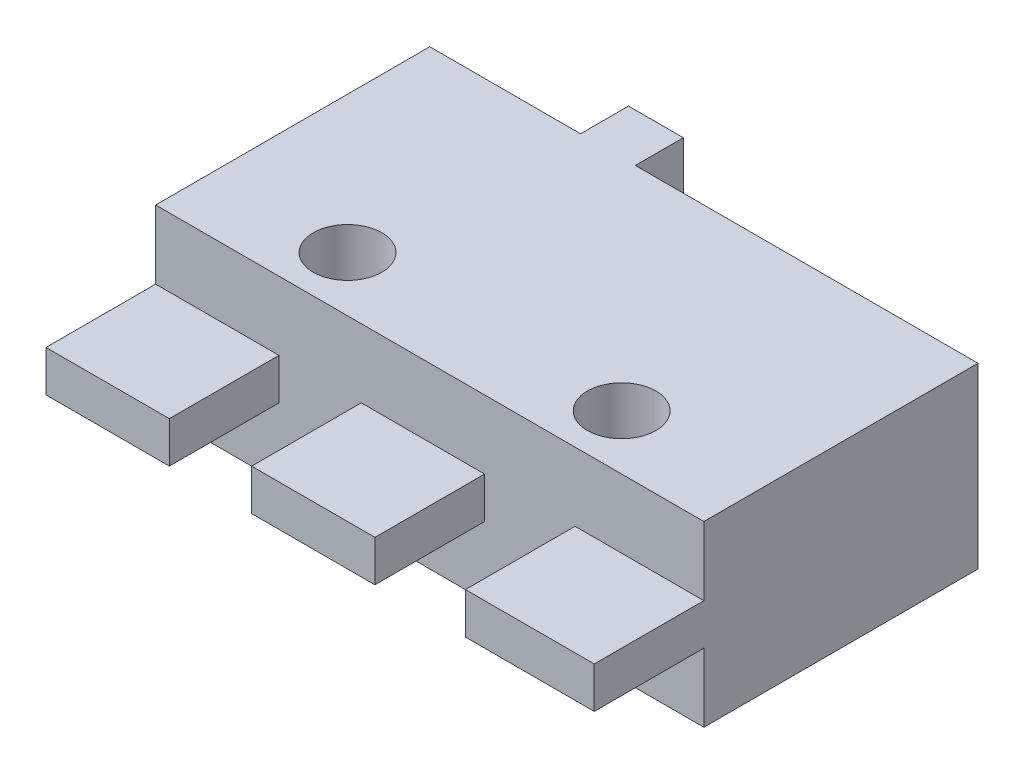
ISO-10303-21;
HEADER;
FILE_DESCRIPTION(('STEP AP214'),'2;1');
FILE_NAME('part.step','',(''),(''),'','','');
FILE_SCHEMA(('AUTOMOTIVE_DESIGN { 1 0 10303 214 1 1 1 1 }'));
ENDSEC;
DATA;
#1=APPLICATION_CONTEXT('core data for automotive mechanical design processes');
#2=APPLICATION_PROTOCOL_DEFINITION('international standard','automotive_design',2000,#1);
#3=PRODUCT_CONTEXT('',#1,'mechanical');
#4=PRODUCT('Part','Part','',(#3));
#5=PRODUCT_RELATED_PRODUCT_CATEGORY('part','',(#4));
#6=PRODUCT_DEFINITION_FORMATION('','',#4);
#7=PRODUCT_DEFINITION_CONTEXT('part definition',#1,'design');
#8=PRODUCT_DEFINITION('design','',#6,#7);
#9=PRODUCT_DEFINITION_SHAPE('','',#8);
#10=(LENGTH_UNIT() NAMED_UNIT(*) SI_UNIT(.MILLI.,.METRE.));
#11=(NAMED_UNIT(*) PLANE_ANGLE_UNIT() SI_UNIT($,.RADIAN.));
#12=(NAMED_UNIT(*) SI_UNIT($,.STERADIAN.) SOLID_ANGLE_UNIT());
#13=UNCERTAINTY_MEASURE_WITH_UNIT(LENGTH_MEASURE(1.E-05),#10,'distance_accuracy_value','');
#14=(GEOMETRIC_REPRESENTATION_CONTEXT(3) GLOBAL_UNCERTAINTY_ASSIGNED_CONTEXT((#13)) GLOBAL_UNIT_ASSIGNED_CONTEXT((#10,
#11,#12)) REPRESENTATION_CONTEXT('',''));
#15=CARTESIAN_POINT('',(0.,0.,0.));
#16=DIRECTION('',(0.,0.,1.));
#17=DIRECTION('',(1.,0.,0.));
#18=AXIS2_PLACEMENT_3D('',#15,#16,#17);
#19=CARTESIAN_POINT('',(-9.99999999999999,4.,9.));
#20=DIRECTION('',(0.,-1.,0.));
#21=DIRECTION('',(0.,0.,-1.));
#22=AXIS2_PLACEMENT_3D('',#19,#20,#21);
#23=PLANE('',#22);
#24=DIRECTION('',(0.,0.,1.));
#25=VECTOR('',#24,1.);
#26=CARTESIAN_POINT('',(-2.5,4.,0.));
#27=LINE('',#26,#25);
#28=CARTESIAN_POINT('',(-2.5,4.,5.));
#29=VERTEX_POINT('',#28);
#30=CARTESIAN_POINT('',(-2.5,4.,9.));
#31=VERTEX_POINT('',#30);
#32=EDGE_CURVE('E203',#29,#31,#27,.T.);
#33=ORIENTED_EDGE('',*,*,#32,.T.);
#34=DIRECTION('',(-1.,0.,0.));
#35=VECTOR('',#34,1.);
#36=CARTESIAN_POINT('',(-9.99999999999999,4.,9.));
#37=LINE('',#36,#35);
#38=CARTESIAN_POINT('',(2.,4.,9.));
#39=VERTEX_POINT('',#38);
#40=EDGE_CURVE('E314',#39,#31,#37,.T.);
#41=ORIENTED_EDGE('',*,*,#40,.F.);
#42=DIRECTION('',(0.,0.,1.));
#43=VECTOR('',#42,1.);
#44=CARTESIAN_POINT('',(2.,4.,0.));
#45=LINE('',#44,#43);
#46=CARTESIAN_POINT('',(2.,4.,5.));
#47=VERTEX_POINT('',#46);
#48=EDGE_CURVE('E75',#47,#39,#45,.T.);
#49=ORIENTED_EDGE('',*,*,#48,.F.);
#50=DIRECTION('',(-1.,0.,0.));
#51=VECTOR('',#50,1.);
#52=CARTESIAN_POINT('',(-9.99999999999999,4.,5.));
#53=LINE('',#52,#51);
#54=EDGE_CURVE('E194',#47,#29,#53,.T.);
#55=ORIENTED_EDGE('',*,*,#54,.T.);
#56=EDGE_LOOP('',(#33,#41,#49,#55));
#57=FACE_BOUND('',#56,.T.);
#58=ADVANCED_FACE('F51',(#57),#23,.F.);
#59=DIRECTION('',(0.,0.,1.));
#60=VECTOR('',#59,1.);
#61=CARTESIAN_POINT('',(5.3,4.,0.));
#62=LINE('',#61,#60);
#63=CARTESIAN_POINT('',(5.3,4.,5.));
#64=VERTEX_POINT('',#63);
#65=CARTESIAN_POINT('',(5.3,4.,9.));
#66=VERTEX_POINT('',#65);
#67=EDGE_CURVE('E445',#64,#66,#62,.T.);
#68=ORIENTED_EDGE('',*,*,#67,.T.);
#69=CARTESIAN_POINT('',(9.99999999999999,4.,9.));
#70=VERTEX_POINT('',#69);
#71=EDGE_CURVE('E316',#70,#66,#37,.T.);
#72=ORIENTED_EDGE('',*,*,#71,.F.);
#73=DIRECTION('',(0.,0.,-1.));
#74=VECTOR('',#73,1.);
#75=CARTESIAN_POINT('',(9.99999999999999,4.,9.));
#76=LINE('',#75,#74);
#77=CARTESIAN_POINT('',(9.99999999999999,4.,5.));
#78=VERTEX_POINT('',#77);
#79=EDGE_CURVE('E242',#70,#78,#76,.T.);
#80=ORIENTED_EDGE('',*,*,#79,.T.);
#81=EDGE_CURVE('E213',#78,#64,#53,.T.);
#82=ORIENTED_EDGE('',*,*,#81,.T.);
#83=EDGE_LOOP('',(#68,#72,#80,#82));
#84=FACE_BOUND('',#83,.T.);
#85=ADVANCED_FACE('F444',(#84),#23,.F.);
#86=CARTESIAN_POINT('',(-9.99999999999999,2.5,9.));
#87=DIRECTION('',(0.,1.,0.));
#88=DIRECTION('',(0.,0.,1.));
#89=AXIS2_PLACEMENT_3D('',#86,#87,#88);
#90=PLANE('',#89);
#91=DIRECTION('',(0.,0.,1.));
#92=VECTOR('',#91,1.);
#93=CARTESIAN_POINT('',(-2.5,2.5,9.));
#94=LINE('',#93,#92);
#95=CARTESIAN_POINT('',(-2.5,2.5,5.));
#96=VERTEX_POINT('',#95);
#97=CARTESIAN_POINT('',(-2.5,2.5,9.));
#98=VERTEX_POINT('',#97);
#99=EDGE_CURVE('E370',#96,#98,#94,.T.);
#100=ORIENTED_EDGE('',*,*,#99,.F.);
#101=DIRECTION('',(1.,0.,0.));
#102=VECTOR('',#101,1.);
#103=CARTESIAN_POINT('',(-9.99999999999999,2.5,5.));
#104=LINE('',#103,#102);
#105=CARTESIAN_POINT('',(2.,2.5,5.));
#106=VERTEX_POINT('',#105);
#107=EDGE_CURVE('E196',#96,#106,#104,.T.);
#108=ORIENTED_EDGE('',*,*,#107,.T.);
#109=DIRECTION('',(0.,0.,1.));
#110=VECTOR('',#109,1.);
#111=CARTESIAN_POINT('',(2.,2.5,9.));
#112=LINE('',#111,#110);
#113=CARTESIAN_POINT('',(2.,2.5,9.));
#114=VERTEX_POINT('',#113);
#115=EDGE_CURVE('E369',#106,#114,#112,.T.);
#116=ORIENTED_EDGE('',*,*,#115,.T.);
#117=DIRECTION('',(1.,0.,0.));
#118=VECTOR('',#117,1.);
#119=CARTESIAN_POINT('',(-9.99999999999999,2.5,9.));
#120=LINE('',#119,#118);
#121=EDGE_CURVE('E330',#98,#114,#120,.T.);
#122=ORIENTED_EDGE('',*,*,#121,.F.);
#123=EDGE_LOOP('',(#100,#108,#116,#122));
#124=FACE_BOUND('',#123,.T.);
#125=ADVANCED_FACE('F367',(#124),#90,.F.);
#126=DIRECTION('',(0.,0.,1.));
#127=VECTOR('',#126,1.);
#128=CARTESIAN_POINT('',(5.3,2.5,9.));
#129=LINE('',#128,#127);
#130=CARTESIAN_POINT('',(5.3,2.5,5.));
#131=VERTEX_POINT('',#130);
#132=CARTESIAN_POINT('',(5.3,2.5,9.));
#133=VERTEX_POINT('',#132);
#134=EDGE_CURVE('E380',#131,#133,#129,.T.);
#135=ORIENTED_EDGE('',*,*,#134,.F.);
#136=CARTESIAN_POINT('',(9.99999999999999,2.5,5.));
#137=VERTEX_POINT('',#136);
#138=EDGE_CURVE('E219',#131,#137,#104,.T.);
#139=ORIENTED_EDGE('',*,*,#138,.T.);
#140=DIRECTION('',(0.,0.,-1.));
#141=VECTOR('',#140,1.);
#142=CARTESIAN_POINT('',(9.99999999999999,2.5,9.));
#143=LINE('',#142,#141);
#144=CARTESIAN_POINT('',(9.99999999999999,2.5,9.));
#145=VERTEX_POINT('',#144);
#146=EDGE_CURVE('E230',#145,#137,#143,.T.);
#147=ORIENTED_EDGE('',*,*,#146,.F.);
#148=EDGE_CURVE('E327',#133,#145,#120,.T.);
#149=ORIENTED_EDGE('',*,*,#148,.F.);
#150=EDGE_LOOP('',(#135,#139,#147,#149));
#151=FACE_BOUND('',#150,.T.);
#152=ADVANCED_FACE('F457',(#151),#90,.F.);
#153=CARTESIAN_POINT('',(0.,0.,9.));
#154=DIRECTION('',(0.,0.,-1.));
#155=DIRECTION('',(-1.,0.,0.));
#156=AXIS2_PLACEMENT_3D('',#153,#154,#155);
#157=PLANE('',#156);
#158=DIRECTION('',(0.,1.,0.));
#159=VECTOR('',#158,1.);
#160=CARTESIAN_POINT('',(-2.5,0.,9.));
#161=LINE('',#160,#159);
#162=EDGE_CURVE('E13',#98,#31,#161,.T.);
#163=ORIENTED_EDGE('',*,*,#162,.F.);
#164=ORIENTED_EDGE('',*,*,#121,.T.);
#165=DIRECTION('',(0.,1.,0.));
#166=VECTOR('',#165,1.);
#167=CARTESIAN_POINT('',(2.,0.,9.));
#168=LINE('',#167,#166);
#169=EDGE_CURVE('E295',#114,#39,#168,.T.);
#170=ORIENTED_EDGE('',*,*,#169,.T.);
#171=ORIENTED_EDGE('',*,*,#40,.T.);
#172=EDGE_LOOP('',(#163,#164,#170,#171));
#173=FACE_BOUND('',#172,.T.);
#174=ADVANCED_FACE('F449',(#173),#157,.F.);
#175=DIRECTION('',(0.,1.,0.));
#176=VECTOR('',#175,1.);
#177=CARTESIAN_POINT('',(5.3,0.,9.));
#178=LINE('',#177,#176);
#179=EDGE_CURVE('E298',#133,#66,#178,.T.);
#180=ORIENTED_EDGE('',*,*,#179,.F.);
#181=ORIENTED_EDGE('',*,*,#148,.T.);
#182=DIRECTION('',(0.,1.,0.));
#183=VECTOR('',#182,1.);
#184=CARTESIAN_POINT('',(9.99999999999999,2.5,9.));
#185=LINE('',#184,#183);
#186=EDGE_CURVE('E229',#145,#70,#185,.T.);
#187=ORIENTED_EDGE('',*,*,#186,.T.);
#188=ORIENTED_EDGE('',*,*,#71,.T.);
#189=EDGE_LOOP('',(#180,#181,#187,#188));
#190=FACE_BOUND('',#189,.T.);
#191=ADVANCED_FACE('F446',(#190),#157,.F.);
#192=CARTESIAN_POINT('',(-10.,6.5,-5.));
#193=DIRECTION('',(0.,0.,1.));
#194=DIRECTION('',(1.,0.,0.));
#195=AXIS2_PLACEMENT_3D('',#192,#193,#194);
#196=PLANE('',#195);
#197=DIRECTION('',(0.,-1.,0.));
#198=VECTOR('',#197,1.);
#199=CARTESIAN_POINT('',(-2.50000000000001,0.,-5.));
#200=LINE('',#199,#198);
#201=CARTESIAN_POINT('',(-2.50000000000001,6.5,-5.));
#202=VERTEX_POINT('',#201);
#203=CARTESIAN_POINT('',(-2.50000000000001,0.,-5.));
#204=VERTEX_POINT('',#203);
#205=EDGE_CURVE('E372',#202,#204,#200,.T.);
#206=ORIENTED_EDGE('',*,*,#205,.F.);
#207=DIRECTION('',(-1.,0.,0.));
#208=VECTOR('',#207,1.);
#209=CARTESIAN_POINT('',(-10.,6.5,-5.));
#210=LINE('',#209,#208);
#211=CARTESIAN_POINT('',(9.99999999999999,6.5,-5.));
#212=VERTEX_POINT('',#211);
#213=EDGE_CURVE('E253',#212,#202,#210,.T.);
#214=ORIENTED_EDGE('',*,*,#213,.F.);
#215=DIRECTION('',(0.,-1.,0.));
#216=VECTOR('',#215,1.);
#217=CARTESIAN_POINT('',(9.99999999999999,6.5,-5.));
#218=LINE('',#217,#216);
#219=CARTESIAN_POINT('',(9.99999999999999,0.,-5.));
#220=VERTEX_POINT('',#219);
#221=EDGE_CURVE('E291',#212,#220,#218,.T.);
#222=ORIENTED_EDGE('',*,*,#221,.T.);
#223=DIRECTION('',(-1.,0.,0.));
#224=VECTOR('',#223,1.);
#225=CARTESIAN_POINT('',(-10.,0.,-5.));
#226=LINE('',#225,#224);
#227=EDGE_CURVE('E268',#220,#204,#226,.T.);
#228=ORIENTED_EDGE('',*,*,#227,.T.);
#229=EDGE_LOOP('',(#206,#214,#222,#228));
#230=FACE_BOUND('',#229,.T.);
#231=ADVANCED_FACE('F448',(#230),#196,.F.);
#232=DIRECTION('',(0.,1.,0.));
#233=VECTOR('',#232,1.);
#234=CARTESIAN_POINT('',(-4.50000000000001,0.,-5.));
#235=LINE('',#234,#233);
#236=CARTESIAN_POINT('',(-4.50000000000001,0.,-5.));
#237=VERTEX_POINT('',#236);
#238=CARTESIAN_POINT('',(-4.50000000000001,6.5,-5.));
#239=VERTEX_POINT('',#238);
#240=EDGE_CURVE('E378',#237,#239,#235,.T.);
#241=ORIENTED_EDGE('',*,*,#240,.F.);
#242=CARTESIAN_POINT('',(-10.,0.,-5.));
#243=VERTEX_POINT('',#242);
#244=EDGE_CURVE('E267',#237,#243,#226,.T.);
#245=ORIENTED_EDGE('',*,*,#244,.T.);
#246=DIRECTION('',(0.,-1.,0.));
#247=VECTOR('',#246,1.);
#248=CARTESIAN_POINT('',(-10.,6.5,-5.));
#249=LINE('',#248,#247);
#250=CARTESIAN_POINT('',(-10.,6.5,-5.));
#251=VERTEX_POINT('',#250);
#252=EDGE_CURVE('E287',#251,#243,#249,.T.);
#253=ORIENTED_EDGE('',*,*,#252,.F.);
#254=EDGE_CURVE('E251',#239,#251,#210,.T.);
#255=ORIENTED_EDGE('',*,*,#254,.F.);
#256=EDGE_LOOP('',(#241,#245,#253,#255));
#257=FACE_BOUND('',#256,.T.);
#258=ADVANCED_FACE('F455',(#257),#196,.F.);
#259=CARTESIAN_POINT('',(-10.,6.5,5.));
#260=DIRECTION('',(0.,0.,-1.));
#261=DIRECTION('',(-1.,0.,0.));
#262=AXIS2_PLACEMENT_3D('',#259,#260,#261);
#263=PLANE('',#262);
#264=ORIENTED_EDGE('',*,*,#107,.F.);
#265=DIRECTION('',(0.,1.,0.));
#266=VECTOR('',#265,1.);
#267=CARTESIAN_POINT('',(-2.5,2.25,5.));
#268=LINE('',#267,#266);
#269=EDGE_CURVE('E188',#96,#29,#268,.T.);
#270=ORIENTED_EDGE('',*,*,#269,.T.);
#271=ORIENTED_EDGE('',*,*,#54,.F.);
#272=DIRECTION('',(0.,1.,0.));
#273=VECTOR('',#272,1.);
#274=CARTESIAN_POINT('',(2.,2.25,5.));
#275=LINE('',#274,#273);
#276=EDGE_CURVE('E210',#106,#47,#275,.T.);
#277=ORIENTED_EDGE('',*,*,#276,.F.);
#278=EDGE_LOOP('',(#264,#270,#271,#277));
#279=FACE_BOUND('',#278,.T.);
#280=DIRECTION('',(0.,1.,0.));
#281=VECTOR('',#280,1.);
#282=CARTESIAN_POINT('',(-5.5,2.25,5.));
#283=LINE('',#282,#281);
#284=CARTESIAN_POINT('',(-5.5,2.5,5.));
#285=VERTEX_POINT('',#284);
#286=CARTESIAN_POINT('',(-5.5,4.,5.));
#287=VERTEX_POINT('',#286);
#288=EDGE_CURVE('E200',#285,#287,#283,.T.);
#289=ORIENTED_EDGE('',*,*,#288,.F.);
#290=CARTESIAN_POINT('',(-10.,2.5,5.));
#291=VERTEX_POINT('',#290);
#292=EDGE_CURVE('E225',#291,#285,#104,.T.);
#293=ORIENTED_EDGE('',*,*,#292,.F.);
#294=DIRECTION('',(0.,-1.,0.));
#295=VECTOR('',#294,1.);
#296=CARTESIAN_POINT('',(-10.,6.5,5.));
#297=LINE('',#296,#295);
#298=CARTESIAN_POINT('',(-10.,0.,5.));
#299=VERTEX_POINT('',#298);
#300=EDGE_CURVE('E282',#291,#299,#297,.T.);
#301=ORIENTED_EDGE('',*,*,#300,.T.);
#302=DIRECTION('',(1.,0.,0.));
#303=VECTOR('',#302,1.);
#304=CARTESIAN_POINT('',(-10.,0.,5.));
#305=LINE('',#304,#303);
#306=CARTESIAN_POINT('',(9.99999999999999,0.,5.));
#307=VERTEX_POINT('',#306);
#308=EDGE_CURVE('E252',#299,#307,#305,.T.);
#309=ORIENTED_EDGE('',*,*,#308,.T.);
#310=DIRECTION('',(0.,-1.,0.));
#311=VECTOR('',#310,1.);
#312=CARTESIAN_POINT('',(9.99999999999999,6.5,5.));
#313=LINE('',#312,#311);
#314=EDGE_CURVE('E263',#137,#307,#313,.T.);
#315=ORIENTED_EDGE('',*,*,#314,.F.);
#316=ORIENTED_EDGE('',*,*,#138,.F.);
#317=DIRECTION('',(0.,1.,0.));
#318=VECTOR('',#317,1.);
#319=CARTESIAN_POINT('',(5.3,2.25,5.));
#320=LINE('',#319,#318);
#321=EDGE_CURVE('E359',#131,#64,#320,.T.);
#322=ORIENTED_EDGE('',*,*,#321,.T.);
#323=ORIENTED_EDGE('',*,*,#81,.F.);
#324=CARTESIAN_POINT('',(9.99999999999999,6.5,5.));
#325=VERTEX_POINT('',#324);
#326=EDGE_CURVE('E278',#325,#78,#313,.T.);
#327=ORIENTED_EDGE('',*,*,#326,.F.);
#328=DIRECTION('',(1.,0.,0.));
#329=VECTOR('',#328,1.);
#330=CARTESIAN_POINT('',(-10.,6.5,5.));
#331=LINE('',#330,#329);
#332=CARTESIAN_POINT('',(-10.,6.5,5.));
#333=VERTEX_POINT('',#332);
#334=EDGE_CURVE('E260',#333,#325,#331,.T.);
#335=ORIENTED_EDGE('',*,*,#334,.F.);
#336=CARTESIAN_POINT('',(-9.99999999999999,4.,5.));
#337=VERTEX_POINT('',#336);
#338=EDGE_CURVE('E283',#333,#337,#297,.T.);
#339=ORIENTED_EDGE('',*,*,#338,.T.);
#340=EDGE_CURVE('E214',#287,#337,#53,.T.);
#341=ORIENTED_EDGE('',*,*,#340,.F.);
#342=EDGE_LOOP('',(#289,#293,#301,#309,#315,#316,#322,#323,#327,#335,#339,#341));
#343=FACE_BOUND('',#342,.T.);
#344=ADVANCED_FACE('F190',(#279,#343),#263,.F.);
#345=CARTESIAN_POINT('',(9.99999999999999,6.5,5.));
#346=DIRECTION('',(-1.,0.,0.));
#347=DIRECTION('',(0.,0.,1.));
#348=AXIS2_PLACEMENT_3D('',#345,#346,#347);
#349=PLANE('',#348);
#350=DIRECTION('',(0.,0.,-1.));
#351=VECTOR('',#350,1.);
#352=CARTESIAN_POINT('',(9.99999999999999,0.,5.));
#353=LINE('',#352,#351);
#354=EDGE_CURVE('E246',#307,#220,#353,.T.);
#355=ORIENTED_EDGE('',*,*,#354,.T.);
#356=ORIENTED_EDGE('',*,*,#221,.F.);
#357=DIRECTION('',(0.,0.,-1.));
#358=VECTOR('',#357,1.);
#359=CARTESIAN_POINT('',(9.99999999999999,6.5,5.));
#360=LINE('',#359,#358);
#361=EDGE_CURVE('E247',#325,#212,#360,.T.);
#362=ORIENTED_EDGE('',*,*,#361,.F.);
#363=ORIENTED_EDGE('',*,*,#326,.T.);
#364=ORIENTED_EDGE('',*,*,#79,.F.);
#365=ORIENTED_EDGE('',*,*,#186,.F.);
#366=ORIENTED_EDGE('',*,*,#146,.T.);
#367=ORIENTED_EDGE('',*,*,#314,.T.);
#368=EDGE_LOOP('',(#355,#356,#362,#363,#364,#365,#366,#367));
#369=FACE_BOUND('',#368,.T.);
#370=ADVANCED_FACE('F53',(#369),#349,.F.);
#371=CARTESIAN_POINT('',(-10.,6.5,5.));
#372=DIRECTION('',(1.,0.,0.));
#373=DIRECTION('',(0.,0.,-1.));
#374=AXIS2_PLACEMENT_3D('',#371,#372,#373);
#375=PLANE('',#374);
#376=DIRECTION('',(0.,0.,1.));
#377=VECTOR('',#376,1.);
#378=CARTESIAN_POINT('',(-10.,0.,5.));
#379=LINE('',#378,#377);
#380=EDGE_CURVE('E271',#243,#299,#379,.T.);
#381=ORIENTED_EDGE('',*,*,#380,.T.);
#382=ORIENTED_EDGE('',*,*,#300,.F.);
#383=DIRECTION('',(0.,0.,-1.));
#384=VECTOR('',#383,1.);
#385=CARTESIAN_POINT('',(-9.99999999999999,2.5,9.));
#386=LINE('',#385,#384);
#387=CARTESIAN_POINT('',(-9.99999999999999,2.5,9.));
#388=VERTEX_POINT('',#387);
#389=EDGE_CURVE('E234',#388,#291,#386,.T.);
#390=ORIENTED_EDGE('',*,*,#389,.F.);
#391=DIRECTION('',(0.,-1.,0.));
#392=VECTOR('',#391,1.);
#393=CARTESIAN_POINT('',(-9.99999999999999,2.5,9.));
#394=LINE('',#393,#392);
#395=CARTESIAN_POINT('',(-9.99999999999999,4.,9.));
#396=VERTEX_POINT('',#395);
#397=EDGE_CURVE('E323',#396,#388,#394,.T.);
#398=ORIENTED_EDGE('',*,*,#397,.F.);
#399=DIRECTION('',(0.,0.,-1.));
#400=VECTOR('',#399,1.);
#401=CARTESIAN_POINT('',(-9.99999999999999,4.,9.));
#402=LINE('',#401,#400);
#403=EDGE_CURVE('E238',#396,#337,#402,.T.);
#404=ORIENTED_EDGE('',*,*,#403,.T.);
#405=ORIENTED_EDGE('',*,*,#338,.F.);
#406=DIRECTION('',(0.,0.,1.));
#407=VECTOR('',#406,1.);
#408=CARTESIAN_POINT('',(-10.,6.5,5.));
#409=LINE('',#408,#407);
#410=EDGE_CURVE('E257',#251,#333,#409,.T.);
#411=ORIENTED_EDGE('',*,*,#410,.F.);
#412=ORIENTED_EDGE('',*,*,#252,.T.);
#413=EDGE_LOOP('',(#381,#382,#390,#398,#404,#405,#411,#412));
#414=FACE_BOUND('',#413,.T.);
#415=ADVANCED_FACE('F347',(#414),#375,.F.);
#416=CARTESIAN_POINT('',(0.,6.5,0.));
#417=DIRECTION('',(0.,-1.,0.));
#418=DIRECTION('',(0.,0.,-1.));
#419=AXIS2_PLACEMENT_3D('',#416,#417,#418);
#420=PLANE('',#419);
#421=CARTESIAN_POINT('',(-5.,6.5,3.));
#422=DIRECTION('',(0.,1.,0.));
#423=DIRECTION('',(0.,0.,1.));
#424=AXIS2_PLACEMENT_3D('',#421,#422,#423);
#425=CIRCLE('',#424,1.25);
#426=CARTESIAN_POINT('',(-5.,6.5,4.25));
#427=VERTEX_POINT('',#426);
#428=EDGE_CURVE('E419',#427,#427,#425,.T.);
#429=ORIENTED_EDGE('',*,*,#428,.F.);
#430=EDGE_LOOP('',(#429));
#431=FACE_BOUND('',#430,.T.);
#432=CARTESIAN_POINT('',(5.,6.5,3.));
#433=DIRECTION('',(0.,1.,0.));
#434=DIRECTION('',(0.,0.,-1.));
#435=AXIS2_PLACEMENT_3D('',#432,#433,#434);
#436=CIRCLE('',#435,1.25);
#437=CARTESIAN_POINT('',(5.,6.5,4.25));
#438=VERTEX_POINT('',#437);
#439=EDGE_CURVE('E415',#438,#438,#436,.T.);
#440=ORIENTED_EDGE('',*,*,#439,.F.);
#441=EDGE_LOOP('',(#440));
#442=FACE_BOUND('',#441,.T.);
#443=ORIENTED_EDGE('',*,*,#361,.T.);
#444=ORIENTED_EDGE('',*,*,#213,.T.);
#445=DIRECTION('',(0.,0.,1.));
#446=VECTOR('',#445,1.);
#447=CARTESIAN_POINT('',(-2.50000000000001,6.5,-6.75));
#448=LINE('',#447,#446);
#449=CARTESIAN_POINT('',(-2.50000000000001,6.5,-6.75));
#450=VERTEX_POINT('',#449);
#451=EDGE_CURVE('E396',#450,#202,#448,.T.);
#452=ORIENTED_EDGE('',*,*,#451,.F.);
#453=DIRECTION('',(1.,0.,0.));
#454=VECTOR('',#453,1.);
#455=CARTESIAN_POINT('',(-4.50000000000001,6.5,-6.75));
#456=LINE('',#455,#454);
#457=CARTESIAN_POINT('',(-4.50000000000001,6.5,-6.75));
#458=VERTEX_POINT('',#457);
#459=EDGE_CURVE('E394',#458,#450,#456,.T.);
#460=ORIENTED_EDGE('',*,*,#459,.F.);
#461=DIRECTION('',(0.,0.,1.));
#462=VECTOR('',#461,1.);
#463=CARTESIAN_POINT('',(-4.50000000000001,6.5,-6.75));
#464=LINE('',#463,#462);
#465=EDGE_CURVE('E404',#458,#239,#464,.T.);
#466=ORIENTED_EDGE('',*,*,#465,.T.);
#467=ORIENTED_EDGE('',*,*,#254,.T.);
#468=ORIENTED_EDGE('',*,*,#410,.T.);
#469=ORIENTED_EDGE('',*,*,#334,.T.);
#470=EDGE_LOOP('',(#443,#444,#452,#460,#466,#467,#468,#469));
#471=FACE_BOUND('',#470,.T.);
#472=ADVANCED_FACE('F433',(#431,#442,#471),#420,.F.);
#473=CARTESIAN_POINT('',(0.,0.,0.));
#474=DIRECTION('',(0.,-1.,0.));
#475=DIRECTION('',(0.,0.,-1.));
#476=AXIS2_PLACEMENT_3D('',#473,#474,#475);
#477=PLANE('',#476);
#478=CARTESIAN_POINT('',(-5.,0.,3.));
#479=DIRECTION('',(0.,1.,0.));
#480=DIRECTION('',(0.,0.,1.));
#481=AXIS2_PLACEMENT_3D('',#478,#479,#480);
#482=CIRCLE('',#481,1.25);
#483=CARTESIAN_POINT('',(-5.,0.,4.25));
#484=VERTEX_POINT('',#483);
#485=EDGE_CURVE('E220',#484,#484,#482,.T.);
#486=ORIENTED_EDGE('',*,*,#485,.T.);
#487=EDGE_LOOP('',(#486));
#488=FACE_BOUND('',#487,.T.);
#489=CARTESIAN_POINT('',(5.,0.,3.));
#490=DIRECTION('',(0.,1.,0.));
#491=DIRECTION('',(0.,0.,-1.));
#492=AXIS2_PLACEMENT_3D('',#489,#490,#491);
#493=CIRCLE('',#492,1.25);
#494=CARTESIAN_POINT('',(5.,0.,4.25));
#495=VERTEX_POINT('',#494);
#496=EDGE_CURVE('E423',#495,#495,#493,.T.);
#497=ORIENTED_EDGE('',*,*,#496,.T.);
#498=EDGE_LOOP('',(#497));
#499=FACE_BOUND('',#498,.T.);
#500=ORIENTED_EDGE('',*,*,#354,.F.);
#501=ORIENTED_EDGE('',*,*,#308,.F.);
#502=ORIENTED_EDGE('',*,*,#380,.F.);
#503=ORIENTED_EDGE('',*,*,#244,.F.);
#504=DIRECTION('',(0.,0.,1.));
#505=VECTOR('',#504,1.);
#506=CARTESIAN_POINT('',(-4.50000000000001,0.,-6.75));
#507=LINE('',#506,#505);
#508=CARTESIAN_POINT('',(-4.50000000000001,0.,-6.75));
#509=VERTEX_POINT('',#508);
#510=EDGE_CURVE('E408',#509,#237,#507,.T.);
#511=ORIENTED_EDGE('',*,*,#510,.F.);
#512=DIRECTION('',(-1.,0.,0.));
#513=VECTOR('',#512,1.);
#514=CARTESIAN_POINT('',(-4.50000000000001,0.,-6.75));
#515=LINE('',#514,#513);
#516=CARTESIAN_POINT('',(-2.50000000000001,0.,-6.75));
#517=VERTEX_POINT('',#516);
#518=EDGE_CURVE('E388',#517,#509,#515,.T.);
#519=ORIENTED_EDGE('',*,*,#518,.F.);
#520=DIRECTION('',(0.,0.,1.));
#521=VECTOR('',#520,1.);
#522=CARTESIAN_POINT('',(-2.50000000000001,0.,-6.75));
#523=LINE('',#522,#521);
#524=EDGE_CURVE('E412',#517,#204,#523,.T.);
#525=ORIENTED_EDGE('',*,*,#524,.T.);
#526=ORIENTED_EDGE('',*,*,#227,.F.);
#527=EDGE_LOOP('',(#500,#501,#502,#503,#511,#519,#525,#526));
#528=FACE_BOUND('',#527,.T.);
#529=ADVANCED_FACE('F352',(#488,#499,#528),#477,.T.);
#530=CARTESIAN_POINT('',(-5.5,4.,9.));
#531=VERTEX_POINT('',#530);
#532=EDGE_CURVE('E305',#531,#396,#37,.T.);
#533=ORIENTED_EDGE('',*,*,#532,.F.);
#534=DIRECTION('',(0.,0.,1.));
#535=VECTOR('',#534,1.);
#536=CARTESIAN_POINT('',(-5.49999999999999,4.,0.));
#537=LINE('',#536,#535);
#538=EDGE_CURVE('E67',#287,#531,#537,.T.);
#539=ORIENTED_EDGE('',*,*,#538,.F.);
#540=ORIENTED_EDGE('',*,*,#340,.T.);
#541=ORIENTED_EDGE('',*,*,#403,.F.);
#542=EDGE_LOOP('',(#533,#539,#540,#541));
#543=FACE_BOUND('',#542,.T.);
#544=ADVANCED_FACE('F310',(#543),#23,.F.);
#545=ORIENTED_EDGE('',*,*,#292,.T.);
#546=DIRECTION('',(0.,0.,1.));
#547=VECTOR('',#546,1.);
#548=CARTESIAN_POINT('',(-5.5,2.5,9.));
#549=LINE('',#548,#547);
#550=CARTESIAN_POINT('',(-5.5,2.5,9.));
#551=VERTEX_POINT('',#550);
#552=EDGE_CURVE('E373',#285,#551,#549,.T.);
#553=ORIENTED_EDGE('',*,*,#552,.T.);
#554=EDGE_CURVE('E223',#388,#551,#120,.T.);
#555=ORIENTED_EDGE('',*,*,#554,.F.);
#556=ORIENTED_EDGE('',*,*,#389,.T.);
#557=EDGE_LOOP('',(#545,#553,#555,#556));
#558=FACE_BOUND('',#557,.T.);
#559=ADVANCED_FACE('F462',(#558),#90,.F.);
#560=ORIENTED_EDGE('',*,*,#554,.T.);
#561=DIRECTION('',(0.,1.,0.));
#562=VECTOR('',#561,1.);
#563=CARTESIAN_POINT('',(-5.5,0.,9.));
#564=LINE('',#563,#562);
#565=EDGE_CURVE('E60',#551,#531,#564,.T.);
#566=ORIENTED_EDGE('',*,*,#565,.T.);
#567=ORIENTED_EDGE('',*,*,#532,.T.);
#568=ORIENTED_EDGE('',*,*,#397,.T.);
#569=EDGE_LOOP('',(#560,#566,#567,#568));
#570=FACE_BOUND('',#569,.T.);
#571=ADVANCED_FACE('F304',(#570),#157,.F.);
#572=CARTESIAN_POINT('',(5.,0.,3.));
#573=DIRECTION('',(0.,1.,0.));
#574=DIRECTION('',(0.,0.,1.));
#575=AXIS2_PLACEMENT_3D('',#572,#573,#574);
#576=CYLINDRICAL_SURFACE('',#575,1.25);
#577=CARTESIAN_POINT('',(5.,0.,4.25));
#578=CARTESIAN_POINT('',(5.,0.0677083333333332,4.25));
#579=CARTESIAN_POINT('',(5.,0.135416666666667,4.25));
#580=CARTESIAN_POINT('',(5.,0.270833333333333,4.25));
#581=CARTESIAN_POINT('',(5.,0.338541666666667,4.25));
#582=CARTESIAN_POINT('',(5.,0.473958333333333,4.25));
#583=CARTESIAN_POINT('',(5.,0.541666666666667,4.25));
#584=CARTESIAN_POINT('',(5.,0.677083333333333,4.25));
#585=CARTESIAN_POINT('',(5.,0.744791666666667,4.25));
#586=CARTESIAN_POINT('',(5.,0.880208333333333,4.25));
#587=CARTESIAN_POINT('',(5.,0.947916666666667,4.25));
#588=CARTESIAN_POINT('',(5.,1.08333333333333,4.25));
#589=CARTESIAN_POINT('',(5.,1.15104166666667,4.25));
#590=CARTESIAN_POINT('',(5.,1.28645833333333,4.25));
#591=CARTESIAN_POINT('',(5.,1.35416666666667,4.25));
#592=CARTESIAN_POINT('',(5.,1.48958333333333,4.25));
#593=CARTESIAN_POINT('',(5.,1.55729166666667,4.25));
#594=CARTESIAN_POINT('',(5.,1.69270833333333,4.25));
#595=CARTESIAN_POINT('',(5.,1.76041666666667,4.25));
#596=CARTESIAN_POINT('',(5.,1.89583333333333,4.25));
#597=CARTESIAN_POINT('',(5.,1.96354166666667,4.25));
#598=CARTESIAN_POINT('',(5.,2.09895833333333,4.25));
#599=CARTESIAN_POINT('',(5.,2.16666666666667,4.25));
#600=CARTESIAN_POINT('',(5.,2.30208333333333,4.25));
#601=CARTESIAN_POINT('',(5.,2.36979166666667,4.25));
#602=CARTESIAN_POINT('',(5.,2.50520833333333,4.25));
#603=CARTESIAN_POINT('',(5.,2.57291666666667,4.25));
#604=CARTESIAN_POINT('',(5.,2.70833333333333,4.25));
#605=CARTESIAN_POINT('',(5.,2.77604166666667,4.25));
#606=CARTESIAN_POINT('',(5.,2.91145833333333,4.25));
#607=CARTESIAN_POINT('',(5.,2.97916666666667,4.25));
#608=CARTESIAN_POINT('',(5.,3.11458333333333,4.25));
#609=CARTESIAN_POINT('',(5.,3.18229166666667,4.25));
#610=CARTESIAN_POINT('',(5.,3.31770833333333,4.25));
#611=CARTESIAN_POINT('',(5.,3.38541666666667,4.25));
#612=CARTESIAN_POINT('',(5.,3.52083333333333,4.25));
#613=CARTESIAN_POINT('',(5.,3.58854166666667,4.25));
#614=CARTESIAN_POINT('',(5.,3.72395833333333,4.25));
#615=CARTESIAN_POINT('',(5.,3.79166666666667,4.25));
#616=CARTESIAN_POINT('',(5.,3.92708333333333,4.25));
#617=CARTESIAN_POINT('',(5.,3.99479166666667,4.25));
#618=CARTESIAN_POINT('',(5.,4.13020833333333,4.25));
#619=CARTESIAN_POINT('',(5.,4.19791666666667,4.25));
#620=CARTESIAN_POINT('',(5.,4.33333333333333,4.25));
#621=CARTESIAN_POINT('',(5.,4.40104166666667,4.25));
#622=CARTESIAN_POINT('',(5.,4.53645833333333,4.25));
#623=CARTESIAN_POINT('',(5.,4.60416666666667,4.25));
#624=CARTESIAN_POINT('',(5.,4.73958333333333,4.25));
#625=CARTESIAN_POINT('',(5.,4.80729166666667,4.25));
#626=CARTESIAN_POINT('',(5.,4.94270833333333,4.25));
#627=CARTESIAN_POINT('',(5.,5.01041666666667,4.25));
#628=CARTESIAN_POINT('',(5.,5.14583333333333,4.25));
#629=CARTESIAN_POINT('',(5.,5.21354166666667,4.25));
#630=CARTESIAN_POINT('',(5.,5.34895833333333,4.25));
#631=CARTESIAN_POINT('',(5.,5.41666666666667,4.25));
#632=CARTESIAN_POINT('',(5.,5.55208333333333,4.25));
#633=CARTESIAN_POINT('',(5.,5.61979166666667,4.25));
#634=CARTESIAN_POINT('',(5.,5.75520833333333,4.25));
#635=CARTESIAN_POINT('',(5.,5.82291666666667,4.25));
#636=CARTESIAN_POINT('',(5.,5.95833333333333,4.25));
#637=CARTESIAN_POINT('',(5.,6.02604166666667,4.25));
#638=CARTESIAN_POINT('',(5.,6.16145833333333,4.25));
#639=CARTESIAN_POINT('',(5.,6.22916666666667,4.25));
#640=CARTESIAN_POINT('',(5.,6.36458333333333,4.25));
#641=CARTESIAN_POINT('',(5.,6.43229166666667,4.25));
#642=CARTESIAN_POINT('',(5.,6.5,4.25));
#643=B_SPLINE_CURVE_WITH_KNOTS('',3,(#577,#578,#579,#580,#581,#582,#583,#584,#585,#586,#587,
#588,#589,#590,#591,#592,#593,#594,#595,#596,#597,#598,#599,#600,#601,#602,#603,#604,#605,#606,
#607,#608,#609,#610,#611,#612,#613,#614,#615,#616,#617,#618,#619,#620,#621,#622,#623,#624,#625,
#626,#627,#628,#629,#630,#631,#632,#633,#634,#635,#636,#637,#638,#639,#640,#641,#642),
.UNSPECIFIED.,.F.,.F.,(4,2,2,2,2,2,2,2,2,2,2,2,2,2,2,2,2,2,2,2,2,2,2,2,2,2,2,2,2,2,2,2,4),(0.,
0.203125,0.40625,0.609375,0.8125,1.015625,1.21875,1.421875,1.625,1.828125,2.03125,2.234375,
2.4375,2.640625,2.84375,3.046875,3.25,3.453125,3.65625,3.859375,4.0625,4.265625,4.46875,
4.671875,4.875,5.078125,5.28125,5.484375,5.6875,5.890625,6.09375,6.296875,6.5),.UNSPECIFIED.);
#644=EDGE_CURVE('BSEAM431',#495,#438,#643,.T.);
#645=ORIENTED_EDGE('',*,*,#496,.F.);
#646=ORIENTED_EDGE('',*,*,#439,.T.);
#647=ORIENTED_EDGE('',*,*,#644,.T.);
#648=ORIENTED_EDGE('',*,*,#644,.F.);
#649=EDGE_LOOP('',(#645,#647,#646,#648));
#650=FACE_BOUND('',#649,.T.);
#651=ADVANCED_FACE('F431',(#650),#576,.F.);
#652=CARTESIAN_POINT('',(-5.,0.,3.));
#653=DIRECTION('',(0.,1.,0.));
#654=DIRECTION('',(0.,0.,1.));
#655=AXIS2_PLACEMENT_3D('',#652,#653,#654);
#656=CYLINDRICAL_SURFACE('',#655,1.25);
#657=CARTESIAN_POINT('',(-5.,0.,4.25));
#658=CARTESIAN_POINT('',(-5.,0.0677083333333332,4.25));
#659=CARTESIAN_POINT('',(-5.,0.135416666666667,4.25));
#660=CARTESIAN_POINT('',(-5.,0.270833333333333,4.25));
#661=CARTESIAN_POINT('',(-5.,0.338541666666667,4.25));
#662=CARTESIAN_POINT('',(-5.,0.473958333333333,4.25));
#663=CARTESIAN_POINT('',(-5.,0.541666666666667,4.25));
#664=CARTESIAN_POINT('',(-5.,0.677083333333333,4.25));
#665=CARTESIAN_POINT('',(-5.,0.744791666666667,4.25));
#666=CARTESIAN_POINT('',(-5.,0.880208333333333,4.25));
#667=CARTESIAN_POINT('',(-5.,0.947916666666667,4.25));
#668=CARTESIAN_POINT('',(-5.,1.08333333333333,4.25));
#669=CARTESIAN_POINT('',(-5.,1.15104166666667,4.25));
#670=CARTESIAN_POINT('',(-5.,1.28645833333333,4.25));
#671=CARTESIAN_POINT('',(-5.,1.35416666666667,4.25));
#672=CARTESIAN_POINT('',(-5.,1.48958333333333,4.25));
#673=CARTESIAN_POINT('',(-5.,1.55729166666667,4.25));
#674=CARTESIAN_POINT('',(-5.,1.69270833333333,4.25));
#675=CARTESIAN_POINT('',(-5.,1.76041666666667,4.25));
#676=CARTESIAN_POINT('',(-5.,1.89583333333333,4.25));
#677=CARTESIAN_POINT('',(-5.,1.96354166666667,4.25));
#678=CARTESIAN_POINT('',(-5.,2.09895833333333,4.25));
#679=CARTESIAN_POINT('',(-5.,2.16666666666667,4.25));
#680=CARTESIAN_POINT('',(-5.,2.30208333333333,4.25));
#681=CARTESIAN_POINT('',(-5.,2.36979166666667,4.25));
#682=CARTESIAN_POINT('',(-5.,2.50520833333333,4.25));
#683=CARTESIAN_POINT('',(-5.,2.57291666666667,4.25));
#684=CARTESIAN_POINT('',(-5.,2.70833333333333,4.25));
#685=CARTESIAN_POINT('',(-5.,2.77604166666667,4.25));
#686=CARTESIAN_POINT('',(-5.,2.91145833333333,4.25));
#687=CARTESIAN_POINT('',(-5.,2.97916666666667,4.25));
#688=CARTESIAN_POINT('',(-5.,3.11458333333333,4.25));
#689=CARTESIAN_POINT('',(-5.,3.18229166666667,4.25));
#690=CARTESIAN_POINT('',(-5.,3.31770833333333,4.25));
#691=CARTESIAN_POINT('',(-5.,3.38541666666667,4.25));
#692=CARTESIAN_POINT('',(-5.,3.52083333333333,4.25));
#693=CARTESIAN_POINT('',(-5.,3.58854166666667,4.25));
#694=CARTESIAN_POINT('',(-5.,3.72395833333333,4.25));
#695=CARTESIAN_POINT('',(-5.,3.79166666666667,4.25));
#696=CARTESIAN_POINT('',(-5.,3.92708333333333,4.25));
#697=CARTESIAN_POINT('',(-5.,3.99479166666667,4.25));
#698=CARTESIAN_POINT('',(-5.,4.13020833333333,4.25));
#699=CARTESIAN_POINT('',(-5.,4.19791666666667,4.25));
#700=CARTESIAN_POINT('',(-5.,4.33333333333333,4.25));
#701=CARTESIAN_POINT('',(-5.,4.40104166666667,4.25));
#702=CARTESIAN_POINT('',(-5.,4.53645833333333,4.25));
#703=CARTESIAN_POINT('',(-5.,4.60416666666667,4.25));
#704=CARTESIAN_POINT('',(-5.,4.73958333333333,4.25));
#705=CARTESIAN_POINT('',(-5.,4.80729166666667,4.25));
#706=CARTESIAN_POINT('',(-5.,4.94270833333333,4.25));
#707=CARTESIAN_POINT('',(-5.,5.01041666666667,4.25));
#708=CARTESIAN_POINT('',(-5.,5.14583333333333,4.25));
#709=CARTESIAN_POINT('',(-5.,5.21354166666667,4.25));
#710=CARTESIAN_POINT('',(-5.,5.34895833333333,4.25));
#711=CARTESIAN_POINT('',(-5.,5.41666666666667,4.25));
#712=CARTESIAN_POINT('',(-5.,5.55208333333333,4.25));
#713=CARTESIAN_POINT('',(-5.,5.61979166666667,4.25));
#714=CARTESIAN_POINT('',(-5.,5.75520833333333,4.25));
#715=CARTESIAN_POINT('',(-5.,5.82291666666667,4.25));
#716=CARTESIAN_POINT('',(-5.,5.95833333333333,4.25));
#717=CARTESIAN_POINT('',(-5.,6.02604166666667,4.25));
#718=CARTESIAN_POINT('',(-5.,6.16145833333333,4.25));
#719=CARTESIAN_POINT('',(-5.,6.22916666666667,4.25));
#720=CARTESIAN_POINT('',(-5.,6.36458333333333,4.25));
#721=CARTESIAN_POINT('',(-5.,6.43229166666667,4.25));
#722=CARTESIAN_POINT('',(-5.,6.5,4.25));
#723=B_SPLINE_CURVE_WITH_KNOTS('',3,(#657,#658,#659,#660,#661,#662,#663,#664,#665,#666,#667,
#668,#669,#670,#671,#672,#673,#674,#675,#676,#677,#678,#679,#680,#681,#682,#683,#684,#685,#686,
#687,#688,#689,#690,#691,#692,#693,#694,#695,#696,#697,#698,#699,#700,#701,#702,#703,#704,#705,
#706,#707,#708,#709,#710,#711,#712,#713,#714,#715,#716,#717,#718,#719,#720,#721,#722),
.UNSPECIFIED.,.F.,.F.,(4,2,2,2,2,2,2,2,2,2,2,2,2,2,2,2,2,2,2,2,2,2,2,2,2,2,2,2,2,2,2,2,4),(0.,
0.203125,0.40625,0.609375,0.8125,1.015625,1.21875,1.421875,1.625,1.828125,2.03125,2.234375,
2.4375,2.640625,2.84375,3.046875,3.25,3.453125,3.65625,3.859375,4.0625,4.265625,4.46875,
4.671875,4.875,5.078125,5.28125,5.484375,5.6875,5.890625,6.09375,6.296875,6.5),.UNSPECIFIED.);
#724=EDGE_CURVE('BSEAM509',#484,#427,#723,.T.);
#725=ORIENTED_EDGE('',*,*,#485,.F.);
#726=ORIENTED_EDGE('',*,*,#428,.T.);
#727=ORIENTED_EDGE('',*,*,#724,.T.);
#728=ORIENTED_EDGE('',*,*,#724,.F.);
#729=EDGE_LOOP('',(#725,#727,#726,#728));
#730=FACE_BOUND('',#729,.T.);
#731=ADVANCED_FACE('F509',(#730),#656,.F.);
#732=CARTESIAN_POINT('',(-2.50000000000001,0.,-6.75));
#733=DIRECTION('',(-1.,0.,0.));
#734=DIRECTION('',(0.,0.,1.));
#735=AXIS2_PLACEMENT_3D('',#732,#733,#734);
#736=PLANE('',#735);
#737=ORIENTED_EDGE('',*,*,#205,.T.);
#738=ORIENTED_EDGE('',*,*,#524,.F.);
#739=DIRECTION('',(0.,-1.,0.));
#740=VECTOR('',#739,1.);
#741=CARTESIAN_POINT('',(-2.50000000000001,0.,-6.75));
#742=LINE('',#741,#740);
#743=EDGE_CURVE('E384',#450,#517,#742,.T.);
#744=ORIENTED_EDGE('',*,*,#743,.F.);
#745=ORIENTED_EDGE('',*,*,#451,.T.);
#746=EDGE_LOOP('',(#737,#738,#744,#745));
#747=FACE_BOUND('',#746,.T.);
#748=ADVANCED_FACE('F514',(#747),#736,.F.);
#749=CARTESIAN_POINT('',(-4.50000000000001,0.,-6.75));
#750=DIRECTION('',(1.,0.,0.));
#751=DIRECTION('',(0.,1.,0.));
#752=AXIS2_PLACEMENT_3D('',#749,#750,#751);
#753=PLANE('',#752);
#754=ORIENTED_EDGE('',*,*,#240,.T.);
#755=ORIENTED_EDGE('',*,*,#465,.F.);
#756=DIRECTION('',(0.,1.,0.));
#757=VECTOR('',#756,1.);
#758=CARTESIAN_POINT('',(-4.50000000000001,0.,-6.75));
#759=LINE('',#758,#757);
#760=EDGE_CURVE('E391',#509,#458,#759,.T.);
#761=ORIENTED_EDGE('',*,*,#760,.F.);
#762=ORIENTED_EDGE('',*,*,#510,.T.);
#763=EDGE_LOOP('',(#754,#755,#761,#762));
#764=FACE_BOUND('',#763,.T.);
#765=ADVANCED_FACE('F601',(#764),#753,.F.);
#766=CARTESIAN_POINT('',(0.,0.,-6.75));
#767=DIRECTION('',(0.,0.,-1.));
#768=DIRECTION('',(-1.,0.,0.));
#769=AXIS2_PLACEMENT_3D('',#766,#767,#768);
#770=PLANE('',#769);
#771=ORIENTED_EDGE('',*,*,#743,.T.);
#772=ORIENTED_EDGE('',*,*,#518,.T.);
#773=ORIENTED_EDGE('',*,*,#760,.T.);
#774=ORIENTED_EDGE('',*,*,#459,.T.);
#775=EDGE_LOOP('',(#771,#772,#773,#774));
#776=FACE_BOUND('',#775,.T.);
#777=ADVANCED_FACE('F562',(#776),#770,.T.);
#778=CARTESIAN_POINT('',(5.3,2.25,0.));
#779=DIRECTION('',(-1.,0.,0.));
#780=DIRECTION('',(0.,0.,1.));
#781=AXIS2_PLACEMENT_3D('',#778,#779,#780);
#782=PLANE('',#781);
#783=ORIENTED_EDGE('',*,*,#134,.T.);
#784=ORIENTED_EDGE('',*,*,#179,.T.);
#785=ORIENTED_EDGE('',*,*,#67,.F.);
#786=ORIENTED_EDGE('',*,*,#321,.F.);
#787=EDGE_LOOP('',(#783,#784,#785,#786));
#788=FACE_BOUND('',#787,.T.);
#789=ADVANCED_FACE('F556',(#788),#782,.T.);
#790=CARTESIAN_POINT('',(2.,2.25,0.));
#791=DIRECTION('',(-1.,0.,0.));
#792=DIRECTION('',(0.,0.,1.));
#793=AXIS2_PLACEMENT_3D('',#790,#791,#792);
#794=PLANE('',#793);
#795=ORIENTED_EDGE('',*,*,#276,.T.);
#796=ORIENTED_EDGE('',*,*,#48,.T.);
#797=ORIENTED_EDGE('',*,*,#169,.F.);
#798=ORIENTED_EDGE('',*,*,#115,.F.);
#799=EDGE_LOOP('',(#795,#796,#797,#798));
#800=FACE_BOUND('',#799,.T.);
#801=ADVANCED_FACE('F561',(#800),#794,.F.);
#802=CARTESIAN_POINT('',(-2.5,2.25,0.));
#803=DIRECTION('',(-1.,0.,0.));
#804=DIRECTION('',(0.,0.,1.));
#805=AXIS2_PLACEMENT_3D('',#802,#803,#804);
#806=PLANE('',#805);
#807=ORIENTED_EDGE('',*,*,#99,.T.);
#808=ORIENTED_EDGE('',*,*,#162,.T.);
#809=ORIENTED_EDGE('',*,*,#32,.F.);
#810=ORIENTED_EDGE('',*,*,#269,.F.);
#811=EDGE_LOOP('',(#807,#808,#809,#810));
#812=FACE_BOUND('',#811,.T.);
#813=ADVANCED_FACE('F204',(#812),#806,.T.);
#814=CARTESIAN_POINT('',(-5.49999999999999,2.25,0.));
#815=DIRECTION('',(-1.,0.,0.));
#816=DIRECTION('',(0.,0.,1.));
#817=AXIS2_PLACEMENT_3D('',#814,#815,#816);
#818=PLANE('',#817);
#819=ORIENTED_EDGE('',*,*,#288,.T.);
#820=ORIENTED_EDGE('',*,*,#538,.T.);
#821=ORIENTED_EDGE('',*,*,#565,.F.);
#822=ORIENTED_EDGE('',*,*,#552,.F.);
#823=EDGE_LOOP('',(#819,#820,#821,#822));
#824=FACE_BOUND('',#823,.T.);
#825=ADVANCED_FACE('F584',(#824),#818,.F.);
#826=CLOSED_SHELL('',(#58,#85,#125,#152,#174,#191,#231,#258,#344,#370,#415,#472,#529,#544,#559,
#571,#651,#731,#748,#765,#777,#789,#801,#813,#825));
#827=MANIFOLD_SOLID_BREP('B2',#826);
#828=ADVANCED_BREP_SHAPE_REPRESENTATION('',(#18,#827),#14);
#829=SHAPE_DEFINITION_REPRESENTATION(#9,#828);
ENDSEC;
END-ISO-10303-21;
